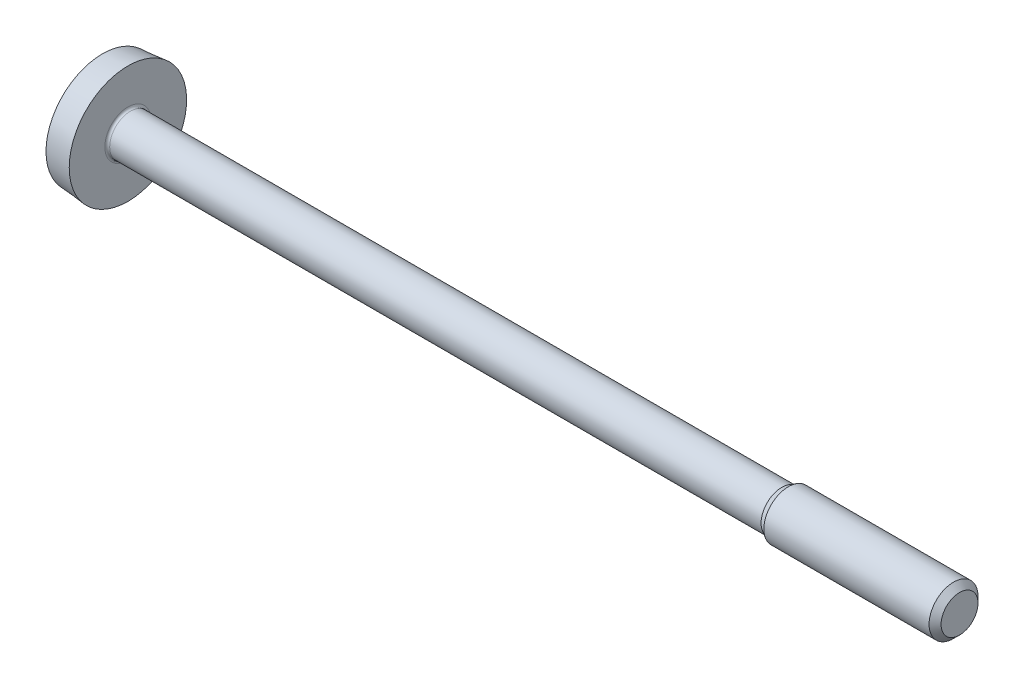
ISO-10303-21;
HEADER;
FILE_DESCRIPTION(('STEP AP214'),'2;1');
FILE_NAME('part.step','',(''),(''),'','','');
FILE_SCHEMA(('AUTOMOTIVE_DESIGN { 1 0 10303 214 1 1 1 1 }'));
ENDSEC;
DATA;
#1=APPLICATION_CONTEXT('core data for automotive mechanical design processes');
#2=APPLICATION_PROTOCOL_DEFINITION('international standard','automotive_design',2000,#1);
#3=PRODUCT_CONTEXT('',#1,'mechanical');
#4=PRODUCT('Part','Part','',(#3));
#5=PRODUCT_RELATED_PRODUCT_CATEGORY('part','',(#4));
#6=PRODUCT_DEFINITION_FORMATION('','',#4);
#7=PRODUCT_DEFINITION_CONTEXT('part definition',#1,'design');
#8=PRODUCT_DEFINITION('design','',#6,#7);
#9=PRODUCT_DEFINITION_SHAPE('','',#8);
#10=(LENGTH_UNIT() NAMED_UNIT(*) SI_UNIT(.MILLI.,.METRE.));
#11=(NAMED_UNIT(*) PLANE_ANGLE_UNIT() SI_UNIT($,.RADIAN.));
#12=(NAMED_UNIT(*) SI_UNIT($,.STERADIAN.) SOLID_ANGLE_UNIT());
#13=UNCERTAINTY_MEASURE_WITH_UNIT(LENGTH_MEASURE(1.E-05),#10,'distance_accuracy_value','');
#14=(GEOMETRIC_REPRESENTATION_CONTEXT(3) GLOBAL_UNCERTAINTY_ASSIGNED_CONTEXT((#13)) GLOBAL_UNIT_ASSIGNED_CONTEXT((#10,
#11,#12)) REPRESENTATION_CONTEXT('',''));
#15=CARTESIAN_POINT('',(0.,0.,0.));
#16=DIRECTION('',(0.,0.,1.));
#17=DIRECTION('',(1.,0.,0.));
#18=AXIS2_PLACEMENT_3D('',#15,#16,#17);
#19=CARTESIAN_POINT('',(3.44029950540034,2.65954792910694E-13,0.));
#20=DIRECTION('',(-1.,0.,0.));
#21=DIRECTION('',(0.,1.,0.));
#22=AXIS2_PLACEMENT_3D('',#19,#20,#21);
#23=SPHERICAL_SURFACE('',#22,5.04029950540034);
#24=CARTESIAN_POINT('',(3.44029950540034,0.29,0.));
#25=DIRECTION('',(0.,1.,0.));
#26=DIRECTION('',(0.,0.,1.));
#27=AXIS2_PLACEMENT_3D('',#24,#25,#26);
#28=CIRCLE('',#27,5.03194983124226);
#29=CARTESIAN_POINT('',(-1.49128432782597,0.29,-1.));
#30=VERTEX_POINT('',#29);
#31=CARTESIAN_POINT('',(-1.58328677375712,0.29,-0.29));
#32=VERTEX_POINT('',#31);
#33=EDGE_CURVE('E11',#30,#32,#28,.T.);
#34=ORIENTED_EDGE('',*,*,#33,.T.);
#35=CARTESIAN_POINT('',(3.44029950540034,2.65954792910694E-13,-0.29));
#36=DIRECTION('',(0.,0.,-1.));
#37=DIRECTION('',(-1.,0.,0.));
#38=AXIS2_PLACEMENT_3D('',#35,#36,#37);
#39=CIRCLE('',#38,5.03194983124225);
#40=CARTESIAN_POINT('',(-1.04,2.29072814756566,-0.29));
#41=VERTEX_POINT('',#40);
#42=EDGE_CURVE('E176',#32,#41,#39,.T.);
#43=ORIENTED_EDGE('',*,*,#42,.T.);
#44=CARTESIAN_POINT('',(-1.04,0.,0.));
#45=DIRECTION('',(-1.,0.,0.));
#46=DIRECTION('',(0.,0.,1.));
#47=AXIS2_PLACEMENT_3D('',#44,#45,#46);
#48=CIRCLE('',#47,2.309011789933);
#49=CARTESIAN_POINT('',(-1.04,-2.29072814756566,-0.29));
#50=VERTEX_POINT('',#49);
#51=EDGE_CURVE('E206',#41,#50,#48,.T.);
#52=ORIENTED_EDGE('',*,*,#51,.T.);
#53=CARTESIAN_POINT('',(3.44029950540034,2.65954792910694E-13,-0.29));
#54=DIRECTION('',(0.,0.,-1.));
#55=DIRECTION('',(-1.,0.,0.));
#56=AXIS2_PLACEMENT_3D('',#53,#54,#55);
#57=CIRCLE('',#56,5.03194983124225);
#58=CARTESIAN_POINT('',(-1.58328677375709,-0.29,-0.29));
#59=VERTEX_POINT('',#58);
#60=EDGE_CURVE('E173',#50,#59,#57,.T.);
#61=ORIENTED_EDGE('',*,*,#60,.T.);
#62=CARTESIAN_POINT('',(3.44029950540034,-0.29,0.));
#63=DIRECTION('',(0.,-1.,0.));
#64=DIRECTION('',(0.,0.,-1.));
#65=AXIS2_PLACEMENT_3D('',#62,#63,#64);
#66=CIRCLE('',#65,5.03194983124223);
#67=CARTESIAN_POINT('',(-1.49128432782593,-0.29,-1.));
#68=VERTEX_POINT('',#67);
#69=EDGE_CURVE('E213',#59,#68,#66,.T.);
#70=ORIENTED_EDGE('',*,*,#69,.T.);
#71=CARTESIAN_POINT('',(3.44029950540034,2.65954792910694E-13,-1.));
#72=DIRECTION('',(0.,0.,-1.));
#73=DIRECTION('',(-1.,0.,0.));
#74=AXIS2_PLACEMENT_3D('',#71,#72,#73);
#75=CIRCLE('',#74,4.94010314711534);
#76=EDGE_CURVE('E42',#68,#30,#75,.T.);
#77=ORIENTED_EDGE('',*,*,#76,.T.);
#78=EDGE_LOOP('',(#34,#43,#52,#61,#70,#77));
#79=FACE_BOUND('',#78,.T.);
#80=ADVANCED_FACE('F34',(#79),#23,.T.);
#81=CARTESIAN_POINT('',(-1.04,-2.29072814756566,0.29));
#82=VERTEX_POINT('',#81);
#83=CARTESIAN_POINT('',(-1.04,2.29072814756566,0.29));
#84=VERTEX_POINT('',#83);
#85=EDGE_CURVE('E203',#82,#84,#48,.T.);
#86=ORIENTED_EDGE('',*,*,#85,.T.);
#87=CARTESIAN_POINT('',(3.44029950540034,2.65954792910694E-13,0.29));
#88=DIRECTION('',(0.,0.,1.));
#89=DIRECTION('',(1.,0.,0.));
#90=AXIS2_PLACEMENT_3D('',#87,#88,#89);
#91=CIRCLE('',#90,5.03194983124225);
#92=CARTESIAN_POINT('',(-1.58328677375712,0.29,0.29));
#93=VERTEX_POINT('',#92);
#94=EDGE_CURVE('E179',#84,#93,#91,.T.);
#95=ORIENTED_EDGE('',*,*,#94,.T.);
#96=CARTESIAN_POINT('',(3.44029950540034,0.29,0.));
#97=DIRECTION('',(0.,1.,0.));
#98=DIRECTION('',(0.,0.,1.));
#99=AXIS2_PLACEMENT_3D('',#96,#97,#98);
#100=CIRCLE('',#99,5.03194983124226);
#101=CARTESIAN_POINT('',(-1.49128432782597,0.29,1.));
#102=VERTEX_POINT('',#101);
#103=EDGE_CURVE('E211',#93,#102,#100,.T.);
#104=ORIENTED_EDGE('',*,*,#103,.T.);
#105=CARTESIAN_POINT('',(3.44029950540034,2.65954792910694E-13,1.));
#106=DIRECTION('',(0.,0.,1.));
#107=DIRECTION('',(1.,0.,0.));
#108=AXIS2_PLACEMENT_3D('',#105,#106,#107);
#109=CIRCLE('',#108,4.94010314711534);
#110=CARTESIAN_POINT('',(-1.49128432782593,-0.29,1.));
#111=VERTEX_POINT('',#110);
#112=EDGE_CURVE('E117',#102,#111,#109,.T.);
#113=ORIENTED_EDGE('',*,*,#112,.T.);
#114=CARTESIAN_POINT('',(3.44029950540034,-0.29,0.));
#115=DIRECTION('',(0.,-1.,0.));
#116=DIRECTION('',(0.,0.,-1.));
#117=AXIS2_PLACEMENT_3D('',#114,#115,#116);
#118=CIRCLE('',#117,5.03194983124223);
#119=CARTESIAN_POINT('',(-1.58328677375709,-0.29,0.29));
#120=VERTEX_POINT('',#119);
#121=EDGE_CURVE('E208',#111,#120,#118,.T.);
#122=ORIENTED_EDGE('',*,*,#121,.T.);
#123=CARTESIAN_POINT('',(3.44029950540034,2.65954792910694E-13,0.29));
#124=DIRECTION('',(0.,0.,1.));
#125=DIRECTION('',(1.,0.,0.));
#126=AXIS2_PLACEMENT_3D('',#123,#124,#125);
#127=CIRCLE('',#126,5.03194983124225);
#128=EDGE_CURVE('E159',#120,#82,#127,.T.);
#129=ORIENTED_EDGE('',*,*,#128,.T.);
#130=EDGE_LOOP('',(#86,#95,#104,#113,#122,#129));
#131=FACE_BOUND('',#130,.T.);
#132=ADVANCED_FACE('F36',(#131),#23,.T.);
#133=CARTESIAN_POINT('',(0.,0.,0.));
#134=DIRECTION('',(1.,0.,0.));
#135=DIRECTION('',(0.,0.,-1.));
#136=AXIS2_PLACEMENT_3D('',#133,#134,#135);
#137=CONICAL_SURFACE('',#136,2.4,0.0872664625997538);
#138=EDGE_CURVE('E204',#84,#41,#48,.T.);
#139=ORIENTED_EDGE('',*,*,#138,.F.);
#140=ORIENTED_EDGE('',*,*,#85,.F.);
#141=EDGE_CURVE('E236',#50,#82,#48,.T.);
#142=ORIENTED_EDGE('',*,*,#141,.F.);
#143=ORIENTED_EDGE('',*,*,#51,.F.);
#144=EDGE_LOOP('',(#139,#140,#142,#143));
#145=FACE_BOUND('',#144,.T.);
#146=CARTESIAN_POINT('',(0.,0.,0.));
#147=DIRECTION('',(-1.,0.,0.));
#148=DIRECTION('',(0.,0.,1.));
#149=AXIS2_PLACEMENT_3D('',#146,#147,#148);
#150=CIRCLE('',#149,2.4);
#151=CARTESIAN_POINT('',(0.,0.,2.4));
#152=VERTEX_POINT('',#151);
#153=EDGE_CURVE('E200',#152,#152,#150,.T.);
#154=ORIENTED_EDGE('',*,*,#153,.T.);
#155=EDGE_LOOP('',(#154));
#156=FACE_BOUND('',#155,.T.);
#157=ADVANCED_FACE('F233',(#145,#156),#137,.T.);
#158=CARTESIAN_POINT('',(0.,2.4,0.));
#159=DIRECTION('',(-1.,0.,0.));
#160=DIRECTION('',(0.,0.,1.));
#161=AXIS2_PLACEMENT_3D('',#158,#159,#160);
#162=PLANE('',#161);
#163=ORIENTED_EDGE('',*,*,#153,.F.);
#164=EDGE_LOOP('',(#163));
#165=FACE_BOUND('',#164,.T.);
#166=CARTESIAN_POINT('',(0.,0.,0.));
#167=DIRECTION('',(-1.,0.,0.));
#168=DIRECTION('',(0.,0.,1.));
#169=AXIS2_PLACEMENT_3D('',#166,#167,#168);
#170=CIRCLE('',#169,0.945);
#171=CARTESIAN_POINT('',(0.,0.,0.945));
#172=VERTEX_POINT('',#171);
#173=EDGE_CURVE('E197',#172,#172,#170,.T.);
#174=ORIENTED_EDGE('',*,*,#173,.T.);
#175=EDGE_LOOP('',(#174));
#176=FACE_BOUND('',#175,.T.);
#177=ADVANCED_FACE('F263',(#165,#176),#162,.F.);
#178=CARTESIAN_POINT('',(0.100000000000008,0.,0.));
#179=DIRECTION('',(-1.,0.,0.));
#180=DIRECTION('',(0.,0.,1.));
#181=AXIS2_PLACEMENT_3D('',#178,#179,#180);
#182=TOROIDAL_SURFACE('',#181,0.945000000000008,0.100000000000008);
#183=ORIENTED_EDGE('',*,*,#173,.F.);
#184=EDGE_LOOP('',(#183));
#185=FACE_BOUND('',#184,.T.);
#186=CARTESIAN_POINT('',(0.100000000000003,0.,0.));
#187=DIRECTION('',(-1.,0.,0.));
#188=DIRECTION('',(0.,0.,1.));
#189=AXIS2_PLACEMENT_3D('',#186,#187,#188);
#190=CIRCLE('',#189,0.845);
#191=CARTESIAN_POINT('',(0.100000000000003,0.,0.845));
#192=VERTEX_POINT('',#191);
#193=EDGE_CURVE('E194',#192,#192,#190,.T.);
#194=ORIENTED_EDGE('',*,*,#193,.T.);
#195=EDGE_LOOP('',(#194));
#196=FACE_BOUND('',#195,.T.);
#197=ADVANCED_FACE('F267',(#185,#196),#182,.F.);
#198=CARTESIAN_POINT('',(34.,0.,0.));
#199=DIRECTION('',(-1.,0.,0.));
#200=DIRECTION('',(0.,0.,1.));
#201=AXIS2_PLACEMENT_3D('',#198,#199,#200);
#202=CYLINDRICAL_SURFACE('',#201,0.845);
#203=ORIENTED_EDGE('',*,*,#193,.F.);
#204=EDGE_LOOP('',(#203));
#205=FACE_BOUND('',#204,.T.);
#206=CARTESIAN_POINT('',(26.731532124827,0.,0.));
#207=DIRECTION('',(-1.,0.,0.));
#208=DIRECTION('',(0.,0.,1.));
#209=AXIS2_PLACEMENT_3D('',#206,#207,#208);
#210=CIRCLE('',#209,0.845);
#211=CARTESIAN_POINT('',(26.731532124827,0.,0.845));
#212=VERTEX_POINT('',#211);
#213=EDGE_CURVE('E191',#212,#212,#210,.T.);
#214=ORIENTED_EDGE('',*,*,#213,.T.);
#215=EDGE_LOOP('',(#214));
#216=FACE_BOUND('',#215,.T.);
#217=ADVANCED_FACE('F273',(#205,#216),#202,.T.);
#218=CARTESIAN_POINT('',(27.,0.,0.));
#219=DIRECTION('',(1.,0.,0.));
#220=DIRECTION('',(0.,0.,-1.));
#221=AXIS2_PLACEMENT_3D('',#218,#219,#220);
#222=CONICAL_SURFACE('',#221,1.,0.523598775598586);
#223=ORIENTED_EDGE('',*,*,#213,.F.);
#224=EDGE_LOOP('',(#223));
#225=FACE_BOUND('',#224,.T.);
#226=CARTESIAN_POINT('',(27.,0.,0.));
#227=DIRECTION('',(-1.,0.,0.));
#228=DIRECTION('',(0.,0.,1.));
#229=AXIS2_PLACEMENT_3D('',#226,#227,#228);
#230=CIRCLE('',#229,1.);
#231=CARTESIAN_POINT('',(27.,0.,1.));
#232=VERTEX_POINT('',#231);
#233=EDGE_CURVE('E188',#232,#232,#230,.T.);
#234=ORIENTED_EDGE('',*,*,#233,.T.);
#235=EDGE_LOOP('',(#234));
#236=FACE_BOUND('',#235,.T.);
#237=ADVANCED_FACE('F277',(#225,#236),#222,.T.);
#238=CARTESIAN_POINT('',(34.,0.,0.));
#239=DIRECTION('',(-1.,0.,0.));
#240=DIRECTION('',(0.,0.,1.));
#241=AXIS2_PLACEMENT_3D('',#238,#239,#240);
#242=CYLINDRICAL_SURFACE('',#241,1.);
#243=ORIENTED_EDGE('',*,*,#233,.F.);
#244=EDGE_LOOP('',(#243));
#245=FACE_BOUND('',#244,.T.);
#246=CARTESIAN_POINT('',(33.7545,0.,0.));
#247=DIRECTION('',(-1.,0.,0.));
#248=DIRECTION('',(0.,0.,1.));
#249=AXIS2_PLACEMENT_3D('',#246,#247,#248);
#250=CIRCLE('',#249,1.);
#251=CARTESIAN_POINT('',(33.7545,0.,1.));
#252=VERTEX_POINT('',#251);
#253=EDGE_CURVE('E185',#252,#252,#250,.T.);
#254=ORIENTED_EDGE('',*,*,#253,.T.);
#255=EDGE_LOOP('',(#254));
#256=FACE_BOUND('',#255,.T.);
#257=ADVANCED_FACE('F281',(#245,#256),#242,.T.);
#258=CARTESIAN_POINT('',(34.,0.,0.));
#259=DIRECTION('',(-1.,0.,0.));
#260=DIRECTION('',(0.,0.,1.));
#261=AXIS2_PLACEMENT_3D('',#258,#259,#260);
#262=CONICAL_SURFACE('',#261,0.7545,0.785398163397443);
#263=ORIENTED_EDGE('',*,*,#253,.F.);
#264=EDGE_LOOP('',(#263));
#265=FACE_BOUND('',#264,.T.);
#266=CARTESIAN_POINT('',(34.,0.,0.));
#267=DIRECTION('',(-1.,0.,0.));
#268=DIRECTION('',(0.,0.,1.));
#269=AXIS2_PLACEMENT_3D('',#266,#267,#268);
#270=CIRCLE('',#269,0.7545);
#271=CARTESIAN_POINT('',(34.,0.,0.7545));
#272=VERTEX_POINT('',#271);
#273=EDGE_CURVE('E182',#272,#272,#270,.T.);
#274=ORIENTED_EDGE('',*,*,#273,.T.);
#275=EDGE_LOOP('',(#274));
#276=FACE_BOUND('',#275,.T.);
#277=ADVANCED_FACE('F285',(#265,#276),#262,.T.);
#278=CARTESIAN_POINT('',(34.,0.7545,0.));
#279=DIRECTION('',(-1.,0.,0.));
#280=DIRECTION('',(0.,0.,1.));
#281=AXIS2_PLACEMENT_3D('',#278,#279,#280);
#282=PLANE('',#281);
#283=ORIENTED_EDGE('',*,*,#273,.F.);
#284=EDGE_LOOP('',(#283));
#285=FACE_BOUND('',#284,.T.);
#286=ADVANCED_FACE('F289',(#285),#282,.F.);
#287=CARTESIAN_POINT('',(-1.64,0.29,0.29));
#288=DIRECTION('',(0.,1.,0.));
#289=DIRECTION('',(0.,0.,1.));
#290=AXIS2_PLACEMENT_3D('',#287,#288,#289);
#291=PLANE('',#290);
#292=DIRECTION('',(1.,0.,0.));
#293=VECTOR('',#292,1.);
#294=CARTESIAN_POINT('',(-1.64,0.29,0.29));
#295=LINE('',#294,#293);
#296=CARTESIAN_POINT('',(-1.04,0.29,0.29));
#297=VERTEX_POINT('',#296);
#298=EDGE_CURVE('E136',#93,#297,#295,.T.);
#299=ORIENTED_EDGE('',*,*,#298,.T.);
#300=DIRECTION('',(0.,0.,1.));
#301=VECTOR('',#300,1.);
#302=CARTESIAN_POINT('',(-1.04,0.29,0.29));
#303=LINE('',#302,#301);
#304=CARTESIAN_POINT('',(-1.04,0.29,1.));
#305=VERTEX_POINT('',#304);
#306=EDGE_CURVE('E129',#297,#305,#303,.T.);
#307=ORIENTED_EDGE('',*,*,#306,.T.);
#308=DIRECTION('',(1.,0.,0.));
#309=VECTOR('',#308,1.);
#310=CARTESIAN_POINT('',(-1.64,0.29,1.));
#311=LINE('',#310,#309);
#312=EDGE_CURVE('E111',#102,#305,#311,.T.);
#313=ORIENTED_EDGE('',*,*,#312,.F.);
#314=ORIENTED_EDGE('',*,*,#103,.F.);
#315=EDGE_LOOP('',(#299,#307,#313,#314));
#316=FACE_BOUND('',#315,.T.);
#317=ADVANCED_FACE('F134',(#316),#291,.F.);
#318=CARTESIAN_POINT('',(-1.64,0.29,-1.));
#319=DIRECTION('',(0.,1.,0.));
#320=DIRECTION('',(0.,0.,1.));
#321=AXIS2_PLACEMENT_3D('',#318,#319,#320);
#322=PLANE('',#321);
#323=DIRECTION('',(1.,0.,0.));
#324=VECTOR('',#323,1.);
#325=CARTESIAN_POINT('',(-1.64,0.29,-1.));
#326=LINE('',#325,#324);
#327=CARTESIAN_POINT('',(-1.04,0.29,-1.));
#328=VERTEX_POINT('',#327);
#329=EDGE_CURVE('E162',#30,#328,#326,.T.);
#330=ORIENTED_EDGE('',*,*,#329,.T.);
#331=DIRECTION('',(0.,0.,1.));
#332=VECTOR('',#331,1.);
#333=CARTESIAN_POINT('',(-1.04,0.29,-1.));
#334=LINE('',#333,#332);
#335=CARTESIAN_POINT('',(-1.04,0.29,-0.29));
#336=VERTEX_POINT('',#335);
#337=EDGE_CURVE('E151',#328,#336,#334,.T.);
#338=ORIENTED_EDGE('',*,*,#337,.T.);
#339=DIRECTION('',(1.,0.,0.));
#340=VECTOR('',#339,1.);
#341=CARTESIAN_POINT('',(-1.64,0.29,-0.29));
#342=LINE('',#341,#340);
#343=EDGE_CURVE('E160',#32,#336,#342,.T.);
#344=ORIENTED_EDGE('',*,*,#343,.F.);
#345=ORIENTED_EDGE('',*,*,#33,.F.);
#346=EDGE_LOOP('',(#330,#338,#344,#345));
#347=FACE_BOUND('',#346,.T.);
#348=ADVANCED_FACE('F225',(#347),#322,.F.);
#349=CARTESIAN_POINT('',(-1.64,-0.29,-1.));
#350=DIRECTION('',(0.,0.,-1.));
#351=DIRECTION('',(-1.,0.,0.));
#352=AXIS2_PLACEMENT_3D('',#349,#350,#351);
#353=PLANE('',#352);
#354=DIRECTION('',(1.,0.,0.));
#355=VECTOR('',#354,1.);
#356=CARTESIAN_POINT('',(-1.64,-0.29,-1.));
#357=LINE('',#356,#355);
#358=CARTESIAN_POINT('',(-1.04,-0.29,-1.));
#359=VERTEX_POINT('',#358);
#360=EDGE_CURVE('E164',#68,#359,#357,.T.);
#361=ORIENTED_EDGE('',*,*,#360,.T.);
#362=DIRECTION('',(0.,1.,0.));
#363=VECTOR('',#362,1.);
#364=CARTESIAN_POINT('',(-1.04,-0.29,-1.));
#365=LINE('',#364,#363);
#366=EDGE_CURVE('E148',#359,#328,#365,.T.);
#367=ORIENTED_EDGE('',*,*,#366,.T.);
#368=ORIENTED_EDGE('',*,*,#329,.F.);
#369=ORIENTED_EDGE('',*,*,#76,.F.);
#370=EDGE_LOOP('',(#361,#367,#368,#369));
#371=FACE_BOUND('',#370,.T.);
#372=ADVANCED_FACE('F219',(#371),#353,.F.);
#373=CARTESIAN_POINT('',(-1.64,-0.29,-0.29));
#374=DIRECTION('',(0.,-1.,0.));
#375=DIRECTION('',(0.,0.,-1.));
#376=AXIS2_PLACEMENT_3D('',#373,#374,#375);
#377=PLANE('',#376);
#378=DIRECTION('',(1.,0.,0.));
#379=VECTOR('',#378,1.);
#380=CARTESIAN_POINT('',(-1.64,-0.29,-0.29));
#381=LINE('',#380,#379);
#382=CARTESIAN_POINT('',(-1.04,-0.29,-0.29));
#383=VERTEX_POINT('',#382);
#384=EDGE_CURVE('E166',#59,#383,#381,.T.);
#385=ORIENTED_EDGE('',*,*,#384,.T.);
#386=DIRECTION('',(0.,0.,-1.));
#387=VECTOR('',#386,1.);
#388=CARTESIAN_POINT('',(-1.04,-0.29,-0.29));
#389=LINE('',#388,#387);
#390=EDGE_CURVE('E145',#383,#359,#389,.T.);
#391=ORIENTED_EDGE('',*,*,#390,.T.);
#392=ORIENTED_EDGE('',*,*,#360,.F.);
#393=ORIENTED_EDGE('',*,*,#69,.F.);
#394=EDGE_LOOP('',(#385,#391,#392,#393));
#395=FACE_BOUND('',#394,.T.);
#396=ADVANCED_FACE('F222',(#395),#377,.F.);
#397=CARTESIAN_POINT('',(-1.64,-0.29,1.));
#398=DIRECTION('',(0.,-1.,0.));
#399=DIRECTION('',(0.,0.,-1.));
#400=AXIS2_PLACEMENT_3D('',#397,#398,#399);
#401=PLANE('',#400);
#402=DIRECTION('',(1.,0.,0.));
#403=VECTOR('',#402,1.);
#404=CARTESIAN_POINT('',(-1.64,-0.29,1.));
#405=LINE('',#404,#403);
#406=CARTESIAN_POINT('',(-1.04,-0.29,1.));
#407=VERTEX_POINT('',#406);
#408=EDGE_CURVE('E121',#111,#407,#405,.T.);
#409=ORIENTED_EDGE('',*,*,#408,.T.);
#410=DIRECTION('',(0.,0.,-1.));
#411=VECTOR('',#410,1.);
#412=CARTESIAN_POINT('',(-1.04,-0.29,1.));
#413=LINE('',#412,#411);
#414=CARTESIAN_POINT('',(-1.04,-0.29,0.29));
#415=VERTEX_POINT('',#414);
#416=EDGE_CURVE('E132',#407,#415,#413,.T.);
#417=ORIENTED_EDGE('',*,*,#416,.T.);
#418=DIRECTION('',(1.,0.,0.));
#419=VECTOR('',#418,1.);
#420=CARTESIAN_POINT('',(-1.64,-0.29,0.29));
#421=LINE('',#420,#419);
#422=EDGE_CURVE('E168',#120,#415,#421,.T.);
#423=ORIENTED_EDGE('',*,*,#422,.F.);
#424=ORIENTED_EDGE('',*,*,#121,.F.);
#425=EDGE_LOOP('',(#409,#417,#423,#424));
#426=FACE_BOUND('',#425,.T.);
#427=ADVANCED_FACE('F243',(#426),#401,.F.);
#428=CARTESIAN_POINT('',(-1.64,0.29,1.));
#429=DIRECTION('',(0.,0.,1.));
#430=DIRECTION('',(1.,0.,0.));
#431=AXIS2_PLACEMENT_3D('',#428,#429,#430);
#432=PLANE('',#431);
#433=ORIENTED_EDGE('',*,*,#312,.T.);
#434=DIRECTION('',(0.,-1.,0.));
#435=VECTOR('',#434,1.);
#436=CARTESIAN_POINT('',(-1.04,0.29,1.));
#437=LINE('',#436,#435);
#438=EDGE_CURVE('E115',#305,#407,#437,.T.);
#439=ORIENTED_EDGE('',*,*,#438,.T.);
#440=ORIENTED_EDGE('',*,*,#408,.F.);
#441=ORIENTED_EDGE('',*,*,#112,.F.);
#442=EDGE_LOOP('',(#433,#439,#440,#441));
#443=FACE_BOUND('',#442,.T.);
#444=ADVANCED_FACE('F113',(#443),#432,.F.);
#445=CARTESIAN_POINT('',(-1.64,2.5,0.29));
#446=DIRECTION('',(0.,0.,1.));
#447=DIRECTION('',(1.,0.,0.));
#448=AXIS2_PLACEMENT_3D('',#445,#446,#447);
#449=PLANE('',#448);
#450=DIRECTION('',(0.,-1.,0.));
#451=VECTOR('',#450,1.);
#452=CARTESIAN_POINT('',(-1.04,2.5,0.29));
#453=LINE('',#452,#451);
#454=EDGE_CURVE('E122',#84,#297,#453,.T.);
#455=ORIENTED_EDGE('',*,*,#454,.T.);
#456=ORIENTED_EDGE('',*,*,#298,.F.);
#457=ORIENTED_EDGE('',*,*,#94,.F.);
#458=EDGE_LOOP('',(#455,#456,#457));
#459=FACE_BOUND('',#458,.T.);
#460=ADVANCED_FACE('F245',(#459),#449,.F.);
#461=CARTESIAN_POINT('',(-1.64,0.29,-0.29));
#462=DIRECTION('',(0.,0.,-1.));
#463=DIRECTION('',(-1.,0.,0.));
#464=AXIS2_PLACEMENT_3D('',#461,#462,#463);
#465=PLANE('',#464);
#466=ORIENTED_EDGE('',*,*,#343,.T.);
#467=DIRECTION('',(0.,1.,0.));
#468=VECTOR('',#467,1.);
#469=CARTESIAN_POINT('',(-1.04,0.29,-0.29));
#470=LINE('',#469,#468);
#471=EDGE_CURVE('E154',#336,#41,#470,.T.);
#472=ORIENTED_EDGE('',*,*,#471,.T.);
#473=ORIENTED_EDGE('',*,*,#42,.F.);
#474=EDGE_LOOP('',(#466,#472,#473));
#475=FACE_BOUND('',#474,.T.);
#476=ADVANCED_FACE('F227',(#475),#465,.F.);
#477=CARTESIAN_POINT('',(-1.64,-2.5,-0.29));
#478=DIRECTION('',(0.,0.,-1.));
#479=DIRECTION('',(-1.,0.,0.));
#480=AXIS2_PLACEMENT_3D('',#477,#478,#479);
#481=PLANE('',#480);
#482=DIRECTION('',(0.,1.,0.));
#483=VECTOR('',#482,1.);
#484=CARTESIAN_POINT('',(-1.04,-2.5,-0.29));
#485=LINE('',#484,#483);
#486=EDGE_CURVE('E49',#50,#383,#485,.T.);
#487=ORIENTED_EDGE('',*,*,#486,.T.);
#488=ORIENTED_EDGE('',*,*,#384,.F.);
#489=ORIENTED_EDGE('',*,*,#60,.F.);
#490=EDGE_LOOP('',(#487,#488,#489));
#491=FACE_BOUND('',#490,.T.);
#492=ADVANCED_FACE('F252',(#491),#481,.F.);
#493=CARTESIAN_POINT('',(-1.64,-0.29,0.29));
#494=DIRECTION('',(0.,0.,1.));
#495=DIRECTION('',(1.,0.,0.));
#496=AXIS2_PLACEMENT_3D('',#493,#494,#495);
#497=PLANE('',#496);
#498=ORIENTED_EDGE('',*,*,#422,.T.);
#499=DIRECTION('',(0.,-1.,0.));
#500=VECTOR('',#499,1.);
#501=CARTESIAN_POINT('',(-1.04,-0.29,0.29));
#502=LINE('',#501,#500);
#503=EDGE_CURVE('E141',#415,#82,#502,.T.);
#504=ORIENTED_EDGE('',*,*,#503,.T.);
#505=ORIENTED_EDGE('',*,*,#128,.F.);
#506=EDGE_LOOP('',(#498,#504,#505));
#507=FACE_BOUND('',#506,.T.);
#508=ADVANCED_FACE('F241',(#507),#497,.F.);
#509=CARTESIAN_POINT('',(-1.04,0.,0.));
#510=DIRECTION('',(1.,0.,0.));
#511=DIRECTION('',(0.,0.,-1.));
#512=AXIS2_PLACEMENT_3D('',#509,#510,#511);
#513=PLANE('',#512);
#514=ORIENTED_EDGE('',*,*,#471,.F.);
#515=ORIENTED_EDGE('',*,*,#337,.F.);
#516=ORIENTED_EDGE('',*,*,#366,.F.);
#517=ORIENTED_EDGE('',*,*,#390,.F.);
#518=ORIENTED_EDGE('',*,*,#486,.F.);
#519=ORIENTED_EDGE('',*,*,#141,.T.);
#520=ORIENTED_EDGE('',*,*,#503,.F.);
#521=ORIENTED_EDGE('',*,*,#416,.F.);
#522=ORIENTED_EDGE('',*,*,#438,.F.);
#523=ORIENTED_EDGE('',*,*,#306,.F.);
#524=ORIENTED_EDGE('',*,*,#454,.F.);
#525=ORIENTED_EDGE('',*,*,#138,.T.);
#526=EDGE_LOOP('',(#514,#515,#516,#517,#518,#519,#520,#521,#522,#523,#524,#525));
#527=FACE_BOUND('',#526,.T.);
#528=ADVANCED_FACE('F127',(#527),#513,.F.);
#529=CLOSED_SHELL('',(#80,#132,#157,#177,#197,#217,#237,#257,#277,#286,#317,#348,#372,#396,#427,
#444,#460,#476,#492,#508,#528));
#530=MANIFOLD_SOLID_BREP('B2',#529);
#531=ADVANCED_BREP_SHAPE_REPRESENTATION('',(#18,#530),#14);
#532=SHAPE_DEFINITION_REPRESENTATION(#9,#531);
ENDSEC;
END-ISO-10303-21;
